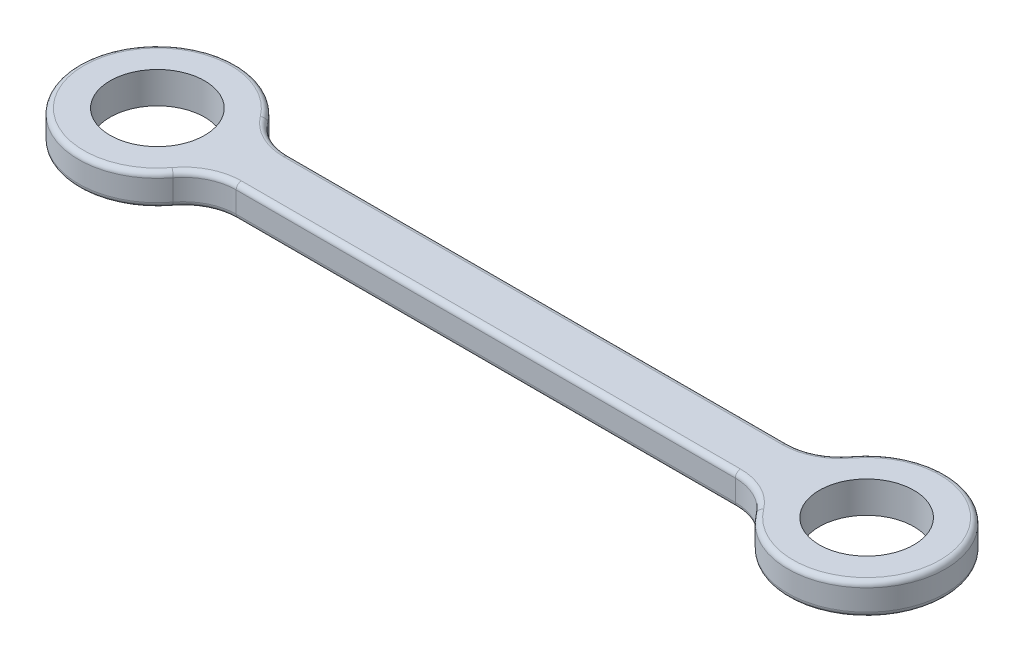
ISO-10303-21;
HEADER;
FILE_DESCRIPTION(('STEP AP214'),'2;1');
FILE_NAME('part.step','',(''),(''),'','','');
FILE_SCHEMA(('AUTOMOTIVE_DESIGN { 1 0 10303 214 1 1 1 1 }'));
ENDSEC;
DATA;
#1=APPLICATION_CONTEXT('core data for automotive mechanical design processes');
#2=APPLICATION_PROTOCOL_DEFINITION('international standard','automotive_design',2000,#1);
#3=PRODUCT_CONTEXT('',#1,'mechanical');
#4=PRODUCT('Part','Part','',(#3));
#5=PRODUCT_RELATED_PRODUCT_CATEGORY('part','',(#4));
#6=PRODUCT_DEFINITION_FORMATION('','',#4);
#7=PRODUCT_DEFINITION_CONTEXT('part definition',#1,'design');
#8=PRODUCT_DEFINITION('design','',#6,#7);
#9=PRODUCT_DEFINITION_SHAPE('','',#8);
#10=(LENGTH_UNIT() NAMED_UNIT(*) SI_UNIT(.MILLI.,.METRE.));
#11=(NAMED_UNIT(*) PLANE_ANGLE_UNIT() SI_UNIT($,.RADIAN.));
#12=(NAMED_UNIT(*) SI_UNIT($,.STERADIAN.) SOLID_ANGLE_UNIT());
#13=UNCERTAINTY_MEASURE_WITH_UNIT(LENGTH_MEASURE(1.E-05),#10,'distance_accuracy_value','');
#14=(GEOMETRIC_REPRESENTATION_CONTEXT(3) GLOBAL_UNCERTAINTY_ASSIGNED_CONTEXT((#13)) GLOBAL_UNIT_ASSIGNED_CONTEXT((#10,
#11,#12)) REPRESENTATION_CONTEXT('',''));
#15=CARTESIAN_POINT('',(0.,0.,0.));
#16=DIRECTION('',(0.,0.,1.));
#17=DIRECTION('',(1.,0.,0.));
#18=AXIS2_PLACEMENT_3D('',#15,#16,#17);
#19=CARTESIAN_POINT('',(66.9540229885058,6.,-15.));
#20=DIRECTION('',(0.,-1.,0.));
#21=DIRECTION('',(0.,0.,-1.));
#22=AXIS2_PLACEMENT_3D('',#19,#20,#21);
#23=PLANE('',#22);
#24=CARTESIAN_POINT('',(-48.0459770114942,6.,0.));
#25=DIRECTION('',(0.,-1.,0.));
#26=DIRECTION('',(0.,0.,-1.));
#27=AXIS2_PLACEMENT_3D('',#24,#25,#26);
#28=CIRCLE('',#27,14.);
#29=CARTESIAN_POINT('',(-36.8459770114942,6.,-8.4));
#30=VERTEX_POINT('',#29);
#31=CARTESIAN_POINT('',(-36.8459770114942,6.,8.4));
#32=VERTEX_POINT('',#31);
#33=EDGE_CURVE('E57',#30,#32,#28,.F.);
#34=ORIENTED_EDGE('',*,*,#33,.T.);
#35=CARTESIAN_POINT('',(-28.0459770114942,6.,15.));
#36=DIRECTION('',(0.,-1.,0.));
#37=DIRECTION('',(0.,0.,-1.));
#38=AXIS2_PLACEMENT_3D('',#35,#36,#37);
#39=CIRCLE('',#38,11.);
#40=CARTESIAN_POINT('',(-28.0459770114942,6.,4.));
#41=VERTEX_POINT('',#40);
#42=EDGE_CURVE('E159',#32,#41,#39,.T.);
#43=ORIENTED_EDGE('',*,*,#42,.T.);
#44=DIRECTION('',(1.,0.,0.));
#45=VECTOR('',#44,1.);
#46=CARTESIAN_POINT('',(66.9540229885058,6.,4.));
#47=LINE('',#46,#45);
#48=CARTESIAN_POINT('',(66.9540229885058,6.,4.));
#49=VERTEX_POINT('',#48);
#50=EDGE_CURVE('E267',#41,#49,#47,.T.);
#51=ORIENTED_EDGE('',*,*,#50,.T.);
#52=CARTESIAN_POINT('',(66.9540229885058,6.,15.));
#53=DIRECTION('',(0.,-1.,0.));
#54=DIRECTION('',(0.,0.,-1.));
#55=AXIS2_PLACEMENT_3D('',#52,#53,#54);
#56=CIRCLE('',#55,11.);
#57=CARTESIAN_POINT('',(75.7540229885058,6.,8.4));
#58=VERTEX_POINT('',#57);
#59=EDGE_CURVE('E270',#49,#58,#56,.T.);
#60=ORIENTED_EDGE('',*,*,#59,.T.);
#61=CARTESIAN_POINT('',(86.9540229885058,6.,0.));
#62=DIRECTION('',(0.,-1.,0.));
#63=DIRECTION('',(0.,0.,-1.));
#64=AXIS2_PLACEMENT_3D('',#61,#62,#63);
#65=CIRCLE('',#64,14.);
#66=CARTESIAN_POINT('',(75.7540229885058,6.,-8.4));
#67=VERTEX_POINT('',#66);
#68=EDGE_CURVE('E273',#58,#67,#65,.F.);
#69=ORIENTED_EDGE('',*,*,#68,.T.);
#70=CARTESIAN_POINT('',(66.9540229885058,6.,-15.));
#71=DIRECTION('',(0.,-1.,0.));
#72=DIRECTION('',(0.,0.,-1.));
#73=AXIS2_PLACEMENT_3D('',#70,#71,#72);
#74=CIRCLE('',#73,11.);
#75=CARTESIAN_POINT('',(66.9540229885058,6.,-4.));
#76=VERTEX_POINT('',#75);
#77=EDGE_CURVE('E276',#67,#76,#74,.T.);
#78=ORIENTED_EDGE('',*,*,#77,.T.);
#79=DIRECTION('',(-1.,0.,0.));
#80=VECTOR('',#79,1.);
#81=CARTESIAN_POINT('',(66.9540229885058,6.,-4.));
#82=LINE('',#81,#80);
#83=CARTESIAN_POINT('',(-28.0459770114942,6.,-4.));
#84=VERTEX_POINT('',#83);
#85=EDGE_CURVE('E279',#76,#84,#82,.T.);
#86=ORIENTED_EDGE('',*,*,#85,.T.);
#87=CARTESIAN_POINT('',(-28.0459770114942,6.,-15.));
#88=DIRECTION('',(0.,-1.,0.));
#89=DIRECTION('',(0.,0.,-1.));
#90=AXIS2_PLACEMENT_3D('',#87,#88,#89);
#91=CIRCLE('',#90,11.);
#92=EDGE_CURVE('E62',#84,#30,#91,.T.);
#93=ORIENTED_EDGE('',*,*,#92,.T.);
#94=EDGE_LOOP('',(#34,#43,#51,#60,#69,#78,#86,#93));
#95=FACE_BOUND('',#94,.T.);
#96=CARTESIAN_POINT('',(-48.0459770114942,6.,0.));
#97=DIRECTION('',(0.,1.,0.));
#98=DIRECTION('',(0.,0.,1.));
#99=AXIS2_PLACEMENT_3D('',#96,#97,#98);
#100=CIRCLE('',#99,9.);
#101=CARTESIAN_POINT('',(-48.0459770114942,6.,9.));
#102=VERTEX_POINT('',#101);
#103=EDGE_CURVE('E367',#102,#102,#100,.T.);
#104=ORIENTED_EDGE('',*,*,#103,.F.);
#105=EDGE_LOOP('',(#104));
#106=FACE_BOUND('',#105,.T.);
#107=CARTESIAN_POINT('',(86.9540229885058,6.,0.));
#108=DIRECTION('',(0.,1.,0.));
#109=DIRECTION('',(0.,0.,1.));
#110=AXIS2_PLACEMENT_3D('',#107,#108,#109);
#111=CIRCLE('',#110,9.);
#112=CARTESIAN_POINT('',(86.9540229885058,6.,9.));
#113=VERTEX_POINT('',#112);
#114=EDGE_CURVE('E443',#113,#113,#111,.T.);
#115=ORIENTED_EDGE('',*,*,#114,.F.);
#116=EDGE_LOOP('',(#115));
#117=FACE_BOUND('',#116,.T.);
#118=ADVANCED_FACE('F39',(#95,#106,#117),#23,.F.);
#119=CARTESIAN_POINT('',(66.9540229885058,0.,-15.));
#120=DIRECTION('',(0.,-1.,0.));
#121=DIRECTION('',(0.,0.,-1.));
#122=AXIS2_PLACEMENT_3D('',#119,#120,#121);
#123=PLANE('',#122);
#124=CARTESIAN_POINT('',(-28.0459770114942,0.,15.));
#125=DIRECTION('',(0.,-1.,0.));
#126=DIRECTION('',(0.,0.,-1.));
#127=AXIS2_PLACEMENT_3D('',#124,#125,#126);
#128=CIRCLE('',#127,11.);
#129=CARTESIAN_POINT('',(-28.0459770114942,0.,4.));
#130=VERTEX_POINT('',#129);
#131=CARTESIAN_POINT('',(-36.8459770114942,0.,8.4));
#132=VERTEX_POINT('',#131);
#133=EDGE_CURVE('E206',#130,#132,#128,.F.);
#134=ORIENTED_EDGE('',*,*,#133,.T.);
#135=CARTESIAN_POINT('',(-48.0459770114942,0.,0.));
#136=DIRECTION('',(0.,-1.,0.));
#137=DIRECTION('',(0.,0.,-1.));
#138=AXIS2_PLACEMENT_3D('',#135,#136,#137);
#139=CIRCLE('',#138,14.);
#140=CARTESIAN_POINT('',(-36.8459770114942,0.,-8.39999999999999));
#141=VERTEX_POINT('',#140);
#142=EDGE_CURVE('E227',#132,#141,#139,.T.);
#143=ORIENTED_EDGE('',*,*,#142,.T.);
#144=CARTESIAN_POINT('',(-28.0459770114942,0.,-15.));
#145=DIRECTION('',(0.,-1.,0.));
#146=DIRECTION('',(0.,0.,-1.));
#147=AXIS2_PLACEMENT_3D('',#144,#145,#146);
#148=CIRCLE('',#147,11.);
#149=CARTESIAN_POINT('',(-28.0459770114942,0.,-4.));
#150=VERTEX_POINT('',#149);
#151=EDGE_CURVE('E224',#141,#150,#148,.F.);
#152=ORIENTED_EDGE('',*,*,#151,.T.);
#153=DIRECTION('',(-1.,0.,0.));
#154=VECTOR('',#153,1.);
#155=CARTESIAN_POINT('',(66.9540229885058,0.,-4.));
#156=LINE('',#155,#154);
#157=CARTESIAN_POINT('',(66.9540229885058,0.,-4.));
#158=VERTEX_POINT('',#157);
#159=EDGE_CURVE('E221',#150,#158,#156,.F.);
#160=ORIENTED_EDGE('',*,*,#159,.T.);
#161=CARTESIAN_POINT('',(66.9540229885058,0.,-15.));
#162=DIRECTION('',(0.,-1.,0.));
#163=DIRECTION('',(0.,0.,-1.));
#164=AXIS2_PLACEMENT_3D('',#161,#162,#163);
#165=CIRCLE('',#164,11.);
#166=CARTESIAN_POINT('',(75.7540229885058,0.,-8.4));
#167=VERTEX_POINT('',#166);
#168=EDGE_CURVE('E218',#158,#167,#165,.F.);
#169=ORIENTED_EDGE('',*,*,#168,.T.);
#170=CARTESIAN_POINT('',(86.9540229885058,0.,0.));
#171=DIRECTION('',(0.,-1.,0.));
#172=DIRECTION('',(0.,0.,-1.));
#173=AXIS2_PLACEMENT_3D('',#170,#171,#172);
#174=CIRCLE('',#173,14.);
#175=CARTESIAN_POINT('',(75.7540229885058,0.,8.39999999999999));
#176=VERTEX_POINT('',#175);
#177=EDGE_CURVE('E215',#167,#176,#174,.T.);
#178=ORIENTED_EDGE('',*,*,#177,.T.);
#179=CARTESIAN_POINT('',(66.9540229885058,0.,15.));
#180=DIRECTION('',(0.,-1.,0.));
#181=DIRECTION('',(0.,0.,-1.));
#182=AXIS2_PLACEMENT_3D('',#179,#180,#181);
#183=CIRCLE('',#182,11.);
#184=CARTESIAN_POINT('',(66.9540229885058,0.,4.));
#185=VERTEX_POINT('',#184);
#186=EDGE_CURVE('E212',#176,#185,#183,.F.);
#187=ORIENTED_EDGE('',*,*,#186,.T.);
#188=DIRECTION('',(1.,0.,0.));
#189=VECTOR('',#188,1.);
#190=CARTESIAN_POINT('',(-28.0459770114942,0.,4.));
#191=LINE('',#190,#189);
#192=EDGE_CURVE('E209',#185,#130,#191,.F.);
#193=ORIENTED_EDGE('',*,*,#192,.T.);
#194=EDGE_LOOP('',(#134,#143,#152,#160,#169,#178,#187,#193));
#195=FACE_BOUND('',#194,.T.);
#196=CARTESIAN_POINT('',(-48.0459770114942,0.,0.));
#197=DIRECTION('',(0.,1.,0.));
#198=DIRECTION('',(0.,0.,1.));
#199=AXIS2_PLACEMENT_3D('',#196,#197,#198);
#200=CIRCLE('',#199,9.);
#201=CARTESIAN_POINT('',(-48.0459770114942,0.,9.));
#202=VERTEX_POINT('',#201);
#203=EDGE_CURVE('E373',#202,#202,#200,.T.);
#204=ORIENTED_EDGE('',*,*,#203,.T.);
#205=EDGE_LOOP('',(#204));
#206=FACE_BOUND('',#205,.T.);
#207=CARTESIAN_POINT('',(86.9540229885058,0.,0.));
#208=DIRECTION('',(0.,1.,0.));
#209=DIRECTION('',(0.,0.,1.));
#210=AXIS2_PLACEMENT_3D('',#207,#208,#209);
#211=CIRCLE('',#210,9.);
#212=CARTESIAN_POINT('',(86.9540229885058,0.,9.));
#213=VERTEX_POINT('',#212);
#214=EDGE_CURVE('E320',#213,#213,#211,.T.);
#215=ORIENTED_EDGE('',*,*,#214,.T.);
#216=EDGE_LOOP('',(#215));
#217=FACE_BOUND('',#216,.T.);
#218=ADVANCED_FACE('F397',(#195,#206,#217),#123,.T.);
#219=CARTESIAN_POINT('',(66.9540229885058,6.,-15.));
#220=DIRECTION('',(0.,-1.,0.));
#221=DIRECTION('',(0.,0.,-1.));
#222=AXIS2_PLACEMENT_3D('',#219,#220,#221);
#223=CYLINDRICAL_SURFACE('',#222,10.);
#224=DIRECTION('',(0.,-1.,0.));
#225=VECTOR('',#224,1.);
#226=CARTESIAN_POINT('',(74.9540229885058,6.,-9.00000000000001));
#227=LINE('',#226,#225);
#228=CARTESIAN_POINT('',(74.9540229885058,5.,-9.00000000000001));
#229=VERTEX_POINT('',#228);
#230=CARTESIAN_POINT('',(74.9540229885058,1.,-9.00000000000001));
#231=VERTEX_POINT('',#230);
#232=EDGE_CURVE('E358',#229,#231,#227,.T.);
#233=ORIENTED_EDGE('',*,*,#232,.T.);
#234=CARTESIAN_POINT('',(66.9540229885058,1.,-15.));
#235=DIRECTION('',(0.,-1.,0.));
#236=DIRECTION('',(0.,0.,-1.));
#237=AXIS2_PLACEMENT_3D('',#234,#235,#236);
#238=CIRCLE('',#237,10.);
#239=CARTESIAN_POINT('',(66.9540229885058,1.,-5.));
#240=VERTEX_POINT('',#239);
#241=EDGE_CURVE('E246',#231,#240,#238,.T.);
#242=ORIENTED_EDGE('',*,*,#241,.T.);
#243=DIRECTION('',(0.,-1.,0.));
#244=VECTOR('',#243,1.);
#245=CARTESIAN_POINT('',(66.9540229885058,6.,-5.));
#246=LINE('',#245,#244);
#247=CARTESIAN_POINT('',(66.9540229885058,5.,-5.));
#248=VERTEX_POINT('',#247);
#249=EDGE_CURVE('E175',#248,#240,#246,.T.);
#250=ORIENTED_EDGE('',*,*,#249,.F.);
#251=CARTESIAN_POINT('',(66.9540229885058,5.,-15.));
#252=DIRECTION('',(0.,-1.,0.));
#253=DIRECTION('',(0.,0.,-1.));
#254=AXIS2_PLACEMENT_3D('',#251,#252,#253);
#255=CIRCLE('',#254,10.);
#256=EDGE_CURVE('E243',#248,#229,#255,.F.);
#257=ORIENTED_EDGE('',*,*,#256,.T.);
#258=EDGE_LOOP('',(#233,#242,#250,#257));
#259=FACE_BOUND('',#258,.T.);
#260=ADVANCED_FACE('F357',(#259),#223,.F.);
#261=CARTESIAN_POINT('',(-28.0459770114942,6.,-5.));
#262=DIRECTION('',(0.,0.,1.));
#263=DIRECTION('',(1.,0.,0.));
#264=AXIS2_PLACEMENT_3D('',#261,#262,#263);
#265=PLANE('',#264);
#266=ORIENTED_EDGE('',*,*,#249,.T.);
#267=DIRECTION('',(-1.,0.,0.));
#268=VECTOR('',#267,1.);
#269=CARTESIAN_POINT('',(-28.0459770114942,1.,-5.));
#270=LINE('',#269,#268);
#271=CARTESIAN_POINT('',(-28.0459770114942,1.,-4.99999999999999));
#272=VERTEX_POINT('',#271);
#273=EDGE_CURVE('E240',#240,#272,#270,.T.);
#274=ORIENTED_EDGE('',*,*,#273,.T.);
#275=DIRECTION('',(0.,-1.,0.));
#276=VECTOR('',#275,1.);
#277=CARTESIAN_POINT('',(-28.0459770114942,6.,-4.99999999999999));
#278=LINE('',#277,#276);
#279=CARTESIAN_POINT('',(-28.0459770114942,5.,-4.99999999999999));
#280=VERTEX_POINT('',#279);
#281=EDGE_CURVE('E192',#280,#272,#278,.T.);
#282=ORIENTED_EDGE('',*,*,#281,.F.);
#283=DIRECTION('',(-1.,0.,0.));
#284=VECTOR('',#283,1.);
#285=CARTESIAN_POINT('',(-28.0459770114942,5.,-5.));
#286=LINE('',#285,#284);
#287=EDGE_CURVE('E237',#280,#248,#286,.F.);
#288=ORIENTED_EDGE('',*,*,#287,.T.);
#289=EDGE_LOOP('',(#266,#274,#282,#288));
#290=FACE_BOUND('',#289,.T.);
#291=ADVANCED_FACE('F410',(#290),#265,.F.);
#292=CARTESIAN_POINT('',(-28.0459770114942,6.,-15.));
#293=DIRECTION('',(0.,-1.,0.));
#294=DIRECTION('',(0.,0.,-1.));
#295=AXIS2_PLACEMENT_3D('',#292,#293,#294);
#296=CYLINDRICAL_SURFACE('',#295,10.);
#297=ORIENTED_EDGE('',*,*,#281,.T.);
#298=CARTESIAN_POINT('',(-28.0459770114942,1.,-15.));
#299=DIRECTION('',(0.,-1.,0.));
#300=DIRECTION('',(0.,0.,-1.));
#301=AXIS2_PLACEMENT_3D('',#298,#299,#300);
#302=CIRCLE('',#301,10.);
#303=CARTESIAN_POINT('',(-36.0459770114942,1.,-9.));
#304=VERTEX_POINT('',#303);
#305=EDGE_CURVE('E234',#272,#304,#302,.T.);
#306=ORIENTED_EDGE('',*,*,#305,.T.);
#307=DIRECTION('',(0.,-1.,0.));
#308=VECTOR('',#307,1.);
#309=CARTESIAN_POINT('',(-36.0459770114942,6.,-9.));
#310=LINE('',#309,#308);
#311=CARTESIAN_POINT('',(-36.0459770114942,5.,-9.));
#312=VERTEX_POINT('',#311);
#313=EDGE_CURVE('E188',#312,#304,#310,.T.);
#314=ORIENTED_EDGE('',*,*,#313,.F.);
#315=CARTESIAN_POINT('',(-28.0459770114942,5.,-15.));
#316=DIRECTION('',(0.,-1.,0.));
#317=DIRECTION('',(0.,0.,-1.));
#318=AXIS2_PLACEMENT_3D('',#315,#316,#317);
#319=CIRCLE('',#318,10.);
#320=EDGE_CURVE('E231',#312,#280,#319,.F.);
#321=ORIENTED_EDGE('',*,*,#320,.T.);
#322=EDGE_LOOP('',(#297,#306,#314,#321));
#323=FACE_BOUND('',#322,.T.);
#324=ADVANCED_FACE('F414',(#323),#296,.F.);
#325=CARTESIAN_POINT('',(-48.0459770114942,6.,0.));
#326=DIRECTION('',(0.,-1.,0.));
#327=DIRECTION('',(0.,0.,-1.));
#328=AXIS2_PLACEMENT_3D('',#325,#326,#327);
#329=CYLINDRICAL_SURFACE('',#328,15.);
#330=ORIENTED_EDGE('',*,*,#313,.T.);
#331=CARTESIAN_POINT('',(-48.0459770114942,1.,0.));
#332=DIRECTION('',(0.,-1.,0.));
#333=DIRECTION('',(0.,0.,-1.));
#334=AXIS2_PLACEMENT_3D('',#331,#332,#333);
#335=CIRCLE('',#334,15.);
#336=CARTESIAN_POINT('',(-36.0459770114942,1.,9.));
#337=VERTEX_POINT('',#336);
#338=EDGE_CURVE('E174',#304,#337,#335,.F.);
#339=ORIENTED_EDGE('',*,*,#338,.T.);
#340=DIRECTION('',(0.,-1.,0.));
#341=VECTOR('',#340,1.);
#342=CARTESIAN_POINT('',(-36.0459770114942,6.,9.));
#343=LINE('',#342,#341);
#344=CARTESIAN_POINT('',(-36.0459770114942,5.,9.));
#345=VERTEX_POINT('',#344);
#346=EDGE_CURVE('E181',#345,#337,#343,.T.);
#347=ORIENTED_EDGE('',*,*,#346,.F.);
#348=CARTESIAN_POINT('',(-48.0459770114942,5.,0.));
#349=DIRECTION('',(0.,-1.,0.));
#350=DIRECTION('',(0.,0.,-1.));
#351=AXIS2_PLACEMENT_3D('',#348,#349,#350);
#352=CIRCLE('',#351,15.);
#353=EDGE_CURVE('E166',#345,#312,#352,.T.);
#354=ORIENTED_EDGE('',*,*,#353,.T.);
#355=EDGE_LOOP('',(#330,#339,#347,#354));
#356=FACE_BOUND('',#355,.T.);
#357=ADVANCED_FACE('F185',(#356),#329,.T.);
#358=CARTESIAN_POINT('',(-28.0459770114942,6.,15.));
#359=DIRECTION('',(0.,-1.,0.));
#360=DIRECTION('',(0.,0.,-1.));
#361=AXIS2_PLACEMENT_3D('',#358,#359,#360);
#362=CYLINDRICAL_SURFACE('',#361,10.);
#363=DIRECTION('',(0.,-1.,0.));
#364=VECTOR('',#363,1.);
#365=CARTESIAN_POINT('',(-28.0459770114942,6.,5.));
#366=LINE('',#365,#364);
#367=CARTESIAN_POINT('',(-28.0459770114942,5.,5.));
#368=VERTEX_POINT('',#367);
#369=CARTESIAN_POINT('',(-28.0459770114942,1.,5.));
#370=VERTEX_POINT('',#369);
#371=EDGE_CURVE('E183',#368,#370,#366,.T.);
#372=ORIENTED_EDGE('',*,*,#371,.F.);
#373=CARTESIAN_POINT('',(-28.0459770114942,5.,15.));
#374=DIRECTION('',(0.,-1.,0.));
#375=DIRECTION('',(0.,0.,-1.));
#376=AXIS2_PLACEMENT_3D('',#373,#374,#375);
#377=CIRCLE('',#376,10.);
#378=EDGE_CURVE('E11',#368,#345,#377,.F.);
#379=ORIENTED_EDGE('',*,*,#378,.T.);
#380=ORIENTED_EDGE('',*,*,#346,.T.);
#381=CARTESIAN_POINT('',(-28.0459770114942,1.,15.));
#382=DIRECTION('',(0.,-1.,0.));
#383=DIRECTION('',(0.,0.,-1.));
#384=AXIS2_PLACEMENT_3D('',#381,#382,#383);
#385=CIRCLE('',#384,10.);
#386=EDGE_CURVE('E49',#337,#370,#385,.T.);
#387=ORIENTED_EDGE('',*,*,#386,.T.);
#388=EDGE_LOOP('',(#372,#379,#380,#387));
#389=FACE_BOUND('',#388,.T.);
#390=ADVANCED_FACE('F180',(#389),#362,.F.);
#391=CARTESIAN_POINT('',(-28.0459770114942,6.,5.));
#392=DIRECTION('',(0.,0.,-1.));
#393=DIRECTION('',(-1.,0.,0.));
#394=AXIS2_PLACEMENT_3D('',#391,#392,#393);
#395=PLANE('',#394);
#396=ORIENTED_EDGE('',*,*,#371,.T.);
#397=DIRECTION('',(1.,0.,0.));
#398=VECTOR('',#397,1.);
#399=CARTESIAN_POINT('',(66.9540229885058,1.,5.));
#400=LINE('',#399,#398);
#401=CARTESIAN_POINT('',(66.9540229885058,1.,5.));
#402=VERTEX_POINT('',#401);
#403=EDGE_CURVE('E264',#370,#402,#400,.T.);
#404=ORIENTED_EDGE('',*,*,#403,.T.);
#405=DIRECTION('',(0.,-1.,0.));
#406=VECTOR('',#405,1.);
#407=CARTESIAN_POINT('',(66.9540229885058,6.,5.));
#408=LINE('',#407,#406);
#409=CARTESIAN_POINT('',(66.9540229885058,5.,5.));
#410=VERTEX_POINT('',#409);
#411=EDGE_CURVE('E194',#410,#402,#408,.T.);
#412=ORIENTED_EDGE('',*,*,#411,.F.);
#413=DIRECTION('',(1.,0.,0.));
#414=VECTOR('',#413,1.);
#415=CARTESIAN_POINT('',(-28.0459770114942,5.,5.));
#416=LINE('',#415,#414);
#417=EDGE_CURVE('E261',#410,#368,#416,.F.);
#418=ORIENTED_EDGE('',*,*,#417,.T.);
#419=EDGE_LOOP('',(#396,#404,#412,#418));
#420=FACE_BOUND('',#419,.T.);
#421=ADVANCED_FACE('F430',(#420),#395,.F.);
#422=CARTESIAN_POINT('',(66.9540229885058,6.,15.));
#423=DIRECTION('',(0.,-1.,0.));
#424=DIRECTION('',(0.,0.,-1.));
#425=AXIS2_PLACEMENT_3D('',#422,#423,#424);
#426=CYLINDRICAL_SURFACE('',#425,10.);
#427=ORIENTED_EDGE('',*,*,#411,.T.);
#428=CARTESIAN_POINT('',(66.9540229885058,1.,15.));
#429=DIRECTION('',(0.,-1.,0.));
#430=DIRECTION('',(0.,0.,-1.));
#431=AXIS2_PLACEMENT_3D('',#428,#429,#430);
#432=CIRCLE('',#431,10.);
#433=CARTESIAN_POINT('',(74.9540229885058,1.,9.));
#434=VERTEX_POINT('',#433);
#435=EDGE_CURVE('E258',#402,#434,#432,.T.);
#436=ORIENTED_EDGE('',*,*,#435,.T.);
#437=DIRECTION('',(0.,-1.,0.));
#438=VECTOR('',#437,1.);
#439=CARTESIAN_POINT('',(74.9540229885058,6.,9.));
#440=LINE('',#439,#438);
#441=CARTESIAN_POINT('',(74.9540229885058,5.,9.));
#442=VERTEX_POINT('',#441);
#443=EDGE_CURVE('E366',#442,#434,#440,.T.);
#444=ORIENTED_EDGE('',*,*,#443,.F.);
#445=CARTESIAN_POINT('',(66.9540229885058,5.,15.));
#446=DIRECTION('',(0.,-1.,0.));
#447=DIRECTION('',(0.,0.,-1.));
#448=AXIS2_PLACEMENT_3D('',#445,#446,#447);
#449=CIRCLE('',#448,10.);
#450=EDGE_CURVE('E255',#442,#410,#449,.F.);
#451=ORIENTED_EDGE('',*,*,#450,.T.);
#452=EDGE_LOOP('',(#427,#436,#444,#451));
#453=FACE_BOUND('',#452,.T.);
#454=ADVANCED_FACE('F381',(#453),#426,.F.);
#455=CARTESIAN_POINT('',(86.9540229885058,6.,0.));
#456=DIRECTION('',(0.,-1.,0.));
#457=DIRECTION('',(0.,0.,-1.));
#458=AXIS2_PLACEMENT_3D('',#455,#456,#457);
#459=CYLINDRICAL_SURFACE('',#458,15.);
#460=ORIENTED_EDGE('',*,*,#443,.T.);
#461=CARTESIAN_POINT('',(86.9540229885058,1.,0.));
#462=DIRECTION('',(0.,-1.,0.));
#463=DIRECTION('',(0.,0.,-1.));
#464=AXIS2_PLACEMENT_3D('',#461,#462,#463);
#465=CIRCLE('',#464,15.);
#466=EDGE_CURVE('E252',#434,#231,#465,.F.);
#467=ORIENTED_EDGE('',*,*,#466,.T.);
#468=ORIENTED_EDGE('',*,*,#232,.F.);
#469=CARTESIAN_POINT('',(86.9540229885058,5.,0.));
#470=DIRECTION('',(0.,-1.,0.));
#471=DIRECTION('',(0.,0.,-1.));
#472=AXIS2_PLACEMENT_3D('',#469,#470,#471);
#473=CIRCLE('',#472,15.);
#474=EDGE_CURVE('E249',#229,#442,#473,.T.);
#475=ORIENTED_EDGE('',*,*,#474,.T.);
#476=EDGE_LOOP('',(#460,#467,#468,#475));
#477=FACE_BOUND('',#476,.T.);
#478=ADVANCED_FACE('F362',(#477),#459,.T.);
#479=CARTESIAN_POINT('',(-48.0459770114942,6.,0.));
#480=DIRECTION('',(0.,-1.,0.));
#481=DIRECTION('',(0.,0.,-1.));
#482=AXIS2_PLACEMENT_3D('',#479,#480,#481);
#483=CYLINDRICAL_SURFACE('',#482,9.);
#484=ORIENTED_EDGE('',*,*,#103,.T.);
#485=EDGE_LOOP('',(#484));
#486=FACE_BOUND('',#485,.T.);
#487=ORIENTED_EDGE('',*,*,#203,.F.);
#488=EDGE_LOOP('',(#487));
#489=FACE_BOUND('',#488,.T.);
#490=ADVANCED_FACE('F457',(#486,#489),#483,.F.);
#491=CARTESIAN_POINT('',(86.9540229885058,6.,0.));
#492=DIRECTION('',(0.,-1.,0.));
#493=DIRECTION('',(0.,0.,-1.));
#494=AXIS2_PLACEMENT_3D('',#491,#492,#493);
#495=CYLINDRICAL_SURFACE('',#494,9.);
#496=ORIENTED_EDGE('',*,*,#114,.T.);
#497=EDGE_LOOP('',(#496));
#498=FACE_BOUND('',#497,.T.);
#499=ORIENTED_EDGE('',*,*,#214,.F.);
#500=EDGE_LOOP('',(#499));
#501=FACE_BOUND('',#500,.T.);
#502=ADVANCED_FACE('F455',(#498,#501),#495,.F.);
#503=CARTESIAN_POINT('',(86.9540229885058,1.,0.));
#504=DIRECTION('',(0.,-1.,0.));
#505=DIRECTION('',(0.,0.,-1.));
#506=AXIS2_PLACEMENT_3D('',#503,#504,#505);
#507=TOROIDAL_SURFACE('',#506,14.,1.);
#508=CARTESIAN_POINT('',(75.7540229885058,1.,8.4));
#509=DIRECTION('',(-0.600000000000004,0.,-0.799999999999997));
#510=DIRECTION('',(-0.799999999999997,0.,0.600000000000005));
#511=AXIS2_PLACEMENT_3D('',#508,#509,#510);
#512=CIRCLE('',#511,1.);
#513=EDGE_CURVE('E312',#176,#434,#512,.T.);
#514=ORIENTED_EDGE('',*,*,#513,.F.);
#515=ORIENTED_EDGE('',*,*,#177,.F.);
#516=CARTESIAN_POINT('',(75.7540229885058,1.,-8.4));
#517=DIRECTION('',(-0.600000000000002,0.,0.799999999999998));
#518=DIRECTION('',(0.799999999999998,0.,0.600000000000002));
#519=AXIS2_PLACEMENT_3D('',#516,#517,#518);
#520=CIRCLE('',#519,1.);
#521=EDGE_CURVE('E316',#231,#167,#520,.T.);
#522=ORIENTED_EDGE('',*,*,#521,.F.);
#523=ORIENTED_EDGE('',*,*,#466,.F.);
#524=EDGE_LOOP('',(#514,#515,#522,#523));
#525=FACE_BOUND('',#524,.T.);
#526=ADVANCED_FACE('F403',(#525),#507,.T.);
#527=CARTESIAN_POINT('',(66.9540229885058,1.,-15.));
#528=DIRECTION('',(0.,-1.,0.));
#529=DIRECTION('',(0.,0.,-1.));
#530=AXIS2_PLACEMENT_3D('',#527,#528,#529);
#531=TOROIDAL_SURFACE('',#530,11.,1.);
#532=ORIENTED_EDGE('',*,*,#521,.T.);
#533=ORIENTED_EDGE('',*,*,#168,.F.);
#534=CARTESIAN_POINT('',(66.9540229885058,1.,-4.));
#535=DIRECTION('',(-1.,0.,0.));
#536=DIRECTION('',(0.,0.,1.));
#537=AXIS2_PLACEMENT_3D('',#534,#535,#536);
#538=CIRCLE('',#537,1.);
#539=EDGE_CURVE('E308',#240,#158,#538,.T.);
#540=ORIENTED_EDGE('',*,*,#539,.F.);
#541=ORIENTED_EDGE('',*,*,#241,.F.);
#542=EDGE_LOOP('',(#532,#533,#540,#541));
#543=FACE_BOUND('',#542,.T.);
#544=ADVANCED_FACE('F407',(#543),#531,.T.);
#545=CARTESIAN_POINT('',(66.9540229885058,1.,15.));
#546=DIRECTION('',(0.,-1.,0.));
#547=DIRECTION('',(0.,0.,-1.));
#548=AXIS2_PLACEMENT_3D('',#545,#546,#547);
#549=TOROIDAL_SURFACE('',#548,11.,1.);
#550=ORIENTED_EDGE('',*,*,#513,.T.);
#551=ORIENTED_EDGE('',*,*,#435,.F.);
#552=CARTESIAN_POINT('',(66.9540229885058,1.,4.));
#553=DIRECTION('',(-1.,0.,0.));
#554=DIRECTION('',(0.,0.,1.));
#555=AXIS2_PLACEMENT_3D('',#552,#553,#554);
#556=CIRCLE('',#555,1.);
#557=EDGE_CURVE('E304',#185,#402,#556,.T.);
#558=ORIENTED_EDGE('',*,*,#557,.F.);
#559=ORIENTED_EDGE('',*,*,#186,.F.);
#560=EDGE_LOOP('',(#550,#551,#558,#559));
#561=FACE_BOUND('',#560,.T.);
#562=ADVANCED_FACE('F387',(#561),#549,.T.);
#563=CARTESIAN_POINT('',(-28.0459770114942,1.,-4.));
#564=DIRECTION('',(1.,0.,0.));
#565=DIRECTION('',(0.,0.,-1.));
#566=AXIS2_PLACEMENT_3D('',#563,#564,#565);
#567=CYLINDRICAL_SURFACE('',#566,1.);
#568=ORIENTED_EDGE('',*,*,#539,.T.);
#569=ORIENTED_EDGE('',*,*,#159,.F.);
#570=CARTESIAN_POINT('',(-28.0459770114942,1.,-4.));
#571=DIRECTION('',(-1.,0.,0.));
#572=DIRECTION('',(0.,0.,1.));
#573=AXIS2_PLACEMENT_3D('',#570,#571,#572);
#574=CIRCLE('',#573,1.);
#575=EDGE_CURVE('E300',#272,#150,#574,.T.);
#576=ORIENTED_EDGE('',*,*,#575,.F.);
#577=ORIENTED_EDGE('',*,*,#273,.F.);
#578=EDGE_LOOP('',(#568,#569,#576,#577));
#579=FACE_BOUND('',#578,.T.);
#580=ADVANCED_FACE('F419',(#579),#567,.T.);
#581=CARTESIAN_POINT('',(-28.0459770114942,1.,4.));
#582=DIRECTION('',(-1.,0.,0.));
#583=DIRECTION('',(0.,0.,1.));
#584=AXIS2_PLACEMENT_3D('',#581,#582,#583);
#585=CYLINDRICAL_SURFACE('',#584,1.);
#586=ORIENTED_EDGE('',*,*,#557,.T.);
#587=ORIENTED_EDGE('',*,*,#403,.F.);
#588=CARTESIAN_POINT('',(-28.0459770114942,1.,4.));
#589=DIRECTION('',(-1.,0.,0.));
#590=DIRECTION('',(0.,0.,1.));
#591=AXIS2_PLACEMENT_3D('',#588,#589,#590);
#592=CIRCLE('',#591,1.);
#593=EDGE_CURVE('E296',#130,#370,#592,.T.);
#594=ORIENTED_EDGE('',*,*,#593,.F.);
#595=ORIENTED_EDGE('',*,*,#192,.F.);
#596=EDGE_LOOP('',(#586,#587,#594,#595));
#597=FACE_BOUND('',#596,.T.);
#598=ADVANCED_FACE('F393',(#597),#585,.T.);
#599=CARTESIAN_POINT('',(-28.0459770114942,1.,-15.));
#600=DIRECTION('',(0.,-1.,0.));
#601=DIRECTION('',(0.,0.,-1.));
#602=AXIS2_PLACEMENT_3D('',#599,#600,#601);
#603=TOROIDAL_SURFACE('',#602,11.,1.);
#604=ORIENTED_EDGE('',*,*,#575,.T.);
#605=ORIENTED_EDGE('',*,*,#151,.F.);
#606=CARTESIAN_POINT('',(-36.8459770114942,1.,-8.39999999999999));
#607=DIRECTION('',(-0.599999999999999,0.,-0.800000000000001));
#608=DIRECTION('',(-0.800000000000001,0.,0.599999999999999));
#609=AXIS2_PLACEMENT_3D('',#606,#607,#608);
#610=CIRCLE('',#609,1.);
#611=EDGE_CURVE('E293',#304,#141,#610,.T.);
#612=ORIENTED_EDGE('',*,*,#611,.F.);
#613=ORIENTED_EDGE('',*,*,#305,.F.);
#614=EDGE_LOOP('',(#604,#605,#612,#613));
#615=FACE_BOUND('',#614,.T.);
#616=ADVANCED_FACE('F423',(#615),#603,.T.);
#617=CARTESIAN_POINT('',(-28.0459770114942,1.,15.));
#618=DIRECTION('',(0.,-1.,0.));
#619=DIRECTION('',(0.,0.,-1.));
#620=AXIS2_PLACEMENT_3D('',#617,#618,#619);
#621=TOROIDAL_SURFACE('',#620,11.,1.);
#622=ORIENTED_EDGE('',*,*,#593,.T.);
#623=ORIENTED_EDGE('',*,*,#386,.F.);
#624=CARTESIAN_POINT('',(-36.8459770114942,1.,8.4));
#625=DIRECTION('',(-0.599999999999998,0.,0.800000000000002));
#626=DIRECTION('',(0.800000000000002,0.,0.599999999999998));
#627=AXIS2_PLACEMENT_3D('',#624,#625,#626);
#628=CIRCLE('',#627,1.);
#629=EDGE_CURVE('E290',#132,#337,#628,.T.);
#630=ORIENTED_EDGE('',*,*,#629,.F.);
#631=ORIENTED_EDGE('',*,*,#133,.F.);
#632=EDGE_LOOP('',(#622,#623,#630,#631));
#633=FACE_BOUND('',#632,.T.);
#634=ADVANCED_FACE('F429',(#633),#621,.T.);
#635=CARTESIAN_POINT('',(-48.0459770114942,1.,0.));
#636=DIRECTION('',(0.,-1.,0.));
#637=DIRECTION('',(0.,0.,-1.));
#638=AXIS2_PLACEMENT_3D('',#635,#636,#637);
#639=TOROIDAL_SURFACE('',#638,14.,1.);
#640=ORIENTED_EDGE('',*,*,#611,.T.);
#641=ORIENTED_EDGE('',*,*,#142,.F.);
#642=ORIENTED_EDGE('',*,*,#629,.T.);
#643=ORIENTED_EDGE('',*,*,#338,.F.);
#644=EDGE_LOOP('',(#640,#641,#642,#643));
#645=FACE_BOUND('',#644,.T.);
#646=ADVANCED_FACE('F425',(#645),#639,.T.);
#647=CARTESIAN_POINT('',(66.9540229885058,5.,-15.));
#648=DIRECTION('',(0.,-1.,0.));
#649=DIRECTION('',(0.,0.,-1.));
#650=AXIS2_PLACEMENT_3D('',#647,#648,#649);
#651=TOROIDAL_SURFACE('',#650,11.,1.);
#652=CARTESIAN_POINT('',(75.7540229885058,5.,-8.4));
#653=DIRECTION('',(0.600000000000002,0.,-0.799999999999998));
#654=DIRECTION('',(-0.799999999999998,0.,-0.600000000000002));
#655=AXIS2_PLACEMENT_3D('',#652,#653,#654);
#656=CIRCLE('',#655,1.);
#657=EDGE_CURVE('E335',#229,#67,#656,.T.);
#658=ORIENTED_EDGE('',*,*,#657,.F.);
#659=ORIENTED_EDGE('',*,*,#256,.F.);
#660=CARTESIAN_POINT('',(66.9540229885058,5.,-4.));
#661=DIRECTION('',(-1.,0.,0.));
#662=DIRECTION('',(0.,0.,1.));
#663=AXIS2_PLACEMENT_3D('',#660,#661,#662);
#664=CIRCLE('',#663,1.);
#665=EDGE_CURVE('E43',#76,#248,#664,.T.);
#666=ORIENTED_EDGE('',*,*,#665,.F.);
#667=ORIENTED_EDGE('',*,*,#77,.F.);
#668=EDGE_LOOP('',(#658,#659,#666,#667));
#669=FACE_BOUND('',#668,.T.);
#670=ADVANCED_FACE('F41',(#669),#651,.T.);
#671=CARTESIAN_POINT('',(66.9540229885058,5.,-4.));
#672=DIRECTION('',(-1.,0.,0.));
#673=DIRECTION('',(0.,0.,1.));
#674=AXIS2_PLACEMENT_3D('',#671,#672,#673);
#675=CYLINDRICAL_SURFACE('',#674,1.);
#676=ORIENTED_EDGE('',*,*,#665,.T.);
#677=ORIENTED_EDGE('',*,*,#287,.F.);
#678=CARTESIAN_POINT('',(-28.0459770114942,5.,-4.));
#679=DIRECTION('',(-1.,0.,0.));
#680=DIRECTION('',(0.,0.,1.));
#681=AXIS2_PLACEMENT_3D('',#678,#679,#680);
#682=CIRCLE('',#681,1.);
#683=EDGE_CURVE('E332',#84,#280,#682,.T.);
#684=ORIENTED_EDGE('',*,*,#683,.F.);
#685=ORIENTED_EDGE('',*,*,#85,.F.);
#686=EDGE_LOOP('',(#676,#677,#684,#685));
#687=FACE_BOUND('',#686,.T.);
#688=ADVANCED_FACE('F348',(#687),#675,.T.);
#689=CARTESIAN_POINT('',(86.9540229885058,5.,0.));
#690=DIRECTION('',(0.,-1.,0.));
#691=DIRECTION('',(0.,0.,-1.));
#692=AXIS2_PLACEMENT_3D('',#689,#690,#691);
#693=TOROIDAL_SURFACE('',#692,14.,1.);
#694=ORIENTED_EDGE('',*,*,#657,.T.);
#695=ORIENTED_EDGE('',*,*,#68,.F.);
#696=CARTESIAN_POINT('',(75.7540229885058,5.,8.4));
#697=DIRECTION('',(-0.600000000000002,0.,-0.799999999999998));
#698=DIRECTION('',(-0.799999999999998,0.,0.600000000000002));
#699=AXIS2_PLACEMENT_3D('',#696,#697,#698);
#700=CIRCLE('',#699,1.);
#701=EDGE_CURVE('E328',#442,#58,#700,.T.);
#702=ORIENTED_EDGE('',*,*,#701,.F.);
#703=ORIENTED_EDGE('',*,*,#474,.F.);
#704=EDGE_LOOP('',(#694,#695,#702,#703));
#705=FACE_BOUND('',#704,.T.);
#706=ADVANCED_FACE('F512',(#705),#693,.T.);
#707=CARTESIAN_POINT('',(-28.0459770114942,5.,-15.));
#708=DIRECTION('',(0.,-1.,0.));
#709=DIRECTION('',(0.,0.,-1.));
#710=AXIS2_PLACEMENT_3D('',#707,#708,#709);
#711=TOROIDAL_SURFACE('',#710,11.,1.);
#712=ORIENTED_EDGE('',*,*,#683,.T.);
#713=ORIENTED_EDGE('',*,*,#320,.F.);
#714=CARTESIAN_POINT('',(-36.8459770114942,5.,-8.4));
#715=DIRECTION('',(-0.599999999999998,0.,-0.800000000000002));
#716=DIRECTION('',(-0.800000000000002,0.,0.599999999999998));
#717=AXIS2_PLACEMENT_3D('',#714,#715,#716);
#718=CIRCLE('',#717,1.);
#719=EDGE_CURVE('E168',#30,#312,#718,.T.);
#720=ORIENTED_EDGE('',*,*,#719,.F.);
#721=ORIENTED_EDGE('',*,*,#92,.F.);
#722=EDGE_LOOP('',(#712,#713,#720,#721));
#723=FACE_BOUND('',#722,.T.);
#724=ADVANCED_FACE('F508',(#723),#711,.T.);
#725=CARTESIAN_POINT('',(66.9540229885058,5.,15.));
#726=DIRECTION('',(0.,-1.,0.));
#727=DIRECTION('',(0.,0.,-1.));
#728=AXIS2_PLACEMENT_3D('',#725,#726,#727);
#729=TOROIDAL_SURFACE('',#728,11.,1.);
#730=ORIENTED_EDGE('',*,*,#701,.T.);
#731=ORIENTED_EDGE('',*,*,#59,.F.);
#732=CARTESIAN_POINT('',(66.9540229885058,5.,4.));
#733=DIRECTION('',(-1.,0.,0.));
#734=DIRECTION('',(0.,0.,1.));
#735=AXIS2_PLACEMENT_3D('',#732,#733,#734);
#736=CIRCLE('',#735,1.);
#737=EDGE_CURVE('E162',#410,#49,#736,.T.);
#738=ORIENTED_EDGE('',*,*,#737,.F.);
#739=ORIENTED_EDGE('',*,*,#450,.F.);
#740=EDGE_LOOP('',(#730,#731,#738,#739));
#741=FACE_BOUND('',#740,.T.);
#742=ADVANCED_FACE('F505',(#741),#729,.T.);
#743=CARTESIAN_POINT('',(-48.0459770114942,5.,0.));
#744=DIRECTION('',(0.,-1.,0.));
#745=DIRECTION('',(0.,0.,-1.));
#746=AXIS2_PLACEMENT_3D('',#743,#744,#745);
#747=TOROIDAL_SURFACE('',#746,14.,1.);
#748=ORIENTED_EDGE('',*,*,#719,.T.);
#749=ORIENTED_EDGE('',*,*,#353,.F.);
#750=CARTESIAN_POINT('',(-36.8459770114942,5.,8.4));
#751=DIRECTION('',(0.600000000000001,0.,-0.799999999999999));
#752=DIRECTION('',(-0.799999999999999,0.,-0.600000000000001));
#753=AXIS2_PLACEMENT_3D('',#750,#751,#752);
#754=CIRCLE('',#753,1.);
#755=EDGE_CURVE('E155',#32,#345,#754,.T.);
#756=ORIENTED_EDGE('',*,*,#755,.F.);
#757=ORIENTED_EDGE('',*,*,#33,.F.);
#758=EDGE_LOOP('',(#748,#749,#756,#757));
#759=FACE_BOUND('',#758,.T.);
#760=ADVANCED_FACE('F167',(#759),#747,.T.);
#761=CARTESIAN_POINT('',(66.9540229885058,5.,4.));
#762=DIRECTION('',(1.,0.,0.));
#763=DIRECTION('',(0.,0.,-1.));
#764=AXIS2_PLACEMENT_3D('',#761,#762,#763);
#765=CYLINDRICAL_SURFACE('',#764,1.);
#766=ORIENTED_EDGE('',*,*,#737,.T.);
#767=ORIENTED_EDGE('',*,*,#50,.F.);
#768=CARTESIAN_POINT('',(-28.0459770114942,5.,4.));
#769=DIRECTION('',(-1.,0.,0.));
#770=DIRECTION('',(0.,0.,1.));
#771=AXIS2_PLACEMENT_3D('',#768,#769,#770);
#772=CIRCLE('',#771,1.);
#773=EDGE_CURVE('E163',#368,#41,#772,.T.);
#774=ORIENTED_EDGE('',*,*,#773,.F.);
#775=ORIENTED_EDGE('',*,*,#417,.F.);
#776=EDGE_LOOP('',(#766,#767,#774,#775));
#777=FACE_BOUND('',#776,.T.);
#778=ADVANCED_FACE('F433',(#777),#765,.T.);
#779=CARTESIAN_POINT('',(-28.0459770114942,5.,15.));
#780=DIRECTION('',(0.,-1.,0.));
#781=DIRECTION('',(0.,0.,-1.));
#782=AXIS2_PLACEMENT_3D('',#779,#780,#781);
#783=TOROIDAL_SURFACE('',#782,11.,1.);
#784=ORIENTED_EDGE('',*,*,#755,.T.);
#785=ORIENTED_EDGE('',*,*,#378,.F.);
#786=ORIENTED_EDGE('',*,*,#773,.T.);
#787=ORIENTED_EDGE('',*,*,#42,.F.);
#788=EDGE_LOOP('',(#784,#785,#786,#787));
#789=FACE_BOUND('',#788,.T.);
#790=ADVANCED_FACE('F157',(#789),#783,.T.);
#791=CLOSED_SHELL('',(#118,#218,#260,#291,#324,#357,#390,#421,#454,#478,#490,#502,#526,#544,
#562,#580,#598,#616,#634,#646,#670,#688,#706,#724,#742,#760,#778,#790));
#792=MANIFOLD_SOLID_BREP('B2',#791);
#793=ADVANCED_BREP_SHAPE_REPRESENTATION('',(#18,#792),#14);
#794=SHAPE_DEFINITION_REPRESENTATION(#9,#793);
ENDSEC;
END-ISO-10303-21;
